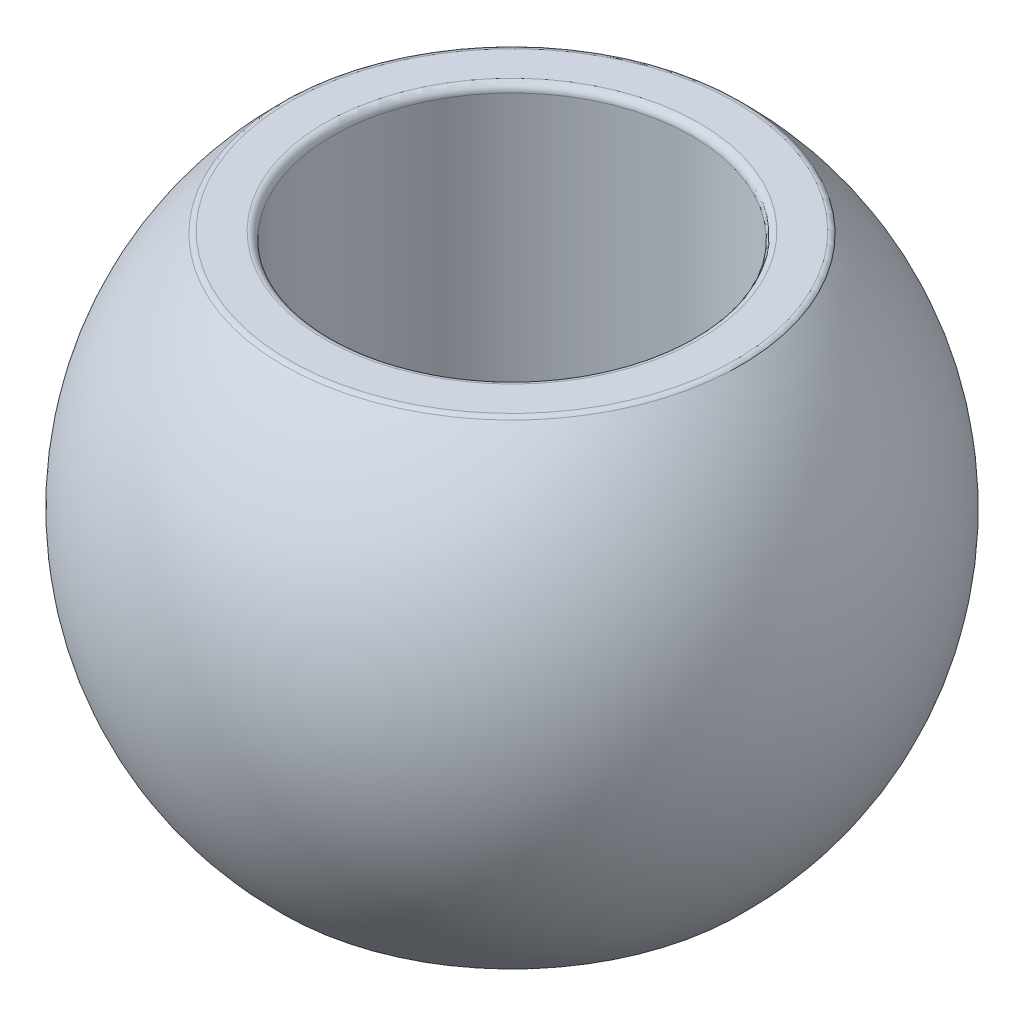
ISO-10303-21;
HEADER;
FILE_DESCRIPTION(('STEP AP214'),'2;1');
FILE_NAME('part.step','',(''),(''),'','','');
FILE_SCHEMA(('AUTOMOTIVE_DESIGN { 1 0 10303 214 1 1 1 1 }'));
ENDSEC;
DATA;
#1=APPLICATION_CONTEXT('core data for automotive mechanical design processes');
#2=APPLICATION_PROTOCOL_DEFINITION('international standard','automotive_design',2000,#1);
#3=PRODUCT_CONTEXT('',#1,'mechanical');
#4=PRODUCT('Part','Part','',(#3));
#5=PRODUCT_RELATED_PRODUCT_CATEGORY('part','',(#4));
#6=PRODUCT_DEFINITION_FORMATION('','',#4);
#7=PRODUCT_DEFINITION_CONTEXT('part definition',#1,'design');
#8=PRODUCT_DEFINITION('design','',#6,#7);
#9=PRODUCT_DEFINITION_SHAPE('','',#8);
#10=(LENGTH_UNIT() NAMED_UNIT(*) SI_UNIT(.MILLI.,.METRE.));
#11=(NAMED_UNIT(*) PLANE_ANGLE_UNIT() SI_UNIT($,.RADIAN.));
#12=(NAMED_UNIT(*) SI_UNIT($,.STERADIAN.) SOLID_ANGLE_UNIT());
#13=UNCERTAINTY_MEASURE_WITH_UNIT(LENGTH_MEASURE(1.E-05),#10,'distance_accuracy_value','');
#14=(GEOMETRIC_REPRESENTATION_CONTEXT(3) GLOBAL_UNCERTAINTY_ASSIGNED_CONTEXT((#13)) GLOBAL_UNIT_ASSIGNED_CONTEXT((#10,
#11,#12)) REPRESENTATION_CONTEXT('',''));
#15=CARTESIAN_POINT('',(0.,0.,0.));
#16=DIRECTION('',(0.,0.,1.));
#17=DIRECTION('',(1.,0.,0.));
#18=AXIS2_PLACEMENT_3D('',#15,#16,#17);
#19=CARTESIAN_POINT('',(0.,8.,0.));
#20=DIRECTION('',(0.,-1.,0.));
#21=DIRECTION('',(0.,0.,-1.));
#22=AXIS2_PLACEMENT_3D('',#19,#20,#21);
#23=PLANE('',#22);
#24=CARTESIAN_POINT('',(0.,8.,0.));
#25=DIRECTION('',(0.,-1.,0.));
#26=DIRECTION('',(0.,0.,-1.));
#27=AXIS2_PLACEMENT_3D('',#24,#25,#26);
#28=CIRCLE('',#27,7.44983221287567);
#29=CARTESIAN_POINT('',(0.,8.,-7.44983221287567));
#30=VERTEX_POINT('',#29);
#31=EDGE_CURVE('E41',#30,#30,#28,.F.);
#32=ORIENTED_EDGE('',*,*,#31,.T.);
#33=EDGE_LOOP('',(#32));
#34=FACE_BOUND('',#33,.T.);
#35=CARTESIAN_POINT('',(0.,8.,0.));
#36=DIRECTION('',(0.,-1.,0.));
#37=DIRECTION('',(0.,0.,-1.));
#38=AXIS2_PLACEMENT_3D('',#35,#36,#37);
#39=CIRCLE('',#38,6.25);
#40=CARTESIAN_POINT('',(0.,8.,-6.25));
#41=VERTEX_POINT('',#40);
#42=EDGE_CURVE('E45',#41,#41,#39,.T.);
#43=ORIENTED_EDGE('',*,*,#42,.T.);
#44=EDGE_LOOP('',(#43));
#45=FACE_BOUND('',#44,.T.);
#46=ADVANCED_FACE('F30',(#34,#45),#23,.F.);
#47=CARTESIAN_POINT('',(0.,0.,0.));
#48=DIRECTION('',(0.,1.,0.));
#49=DIRECTION('',(0.,0.,-1.));
#50=AXIS2_PLACEMENT_3D('',#47,#48,#49);
#51=SPHERICAL_SURFACE('',#50,11.);
#52=CARTESIAN_POINT('',(0.,-7.93023255813953,0.));
#53=DIRECTION('',(0.,1.,0.));
#54=DIRECTION('',(0.,0.,1.));
#55=AXIS2_PLACEMENT_3D('',#52,#53,#54);
#56=CIRCLE('',#55,7.62308412480301);
#57=CARTESIAN_POINT('',(0.,-7.93023255813953,-7.62308412480301));
#58=VERTEX_POINT('',#57);
#59=EDGE_CURVE('E56',#58,#58,#56,.T.);
#60=CARTESIAN_POINT('',(0.,7.93023255813953,0.));
#61=DIRECTION('',(0.,-1.,0.));
#62=DIRECTION('',(0.,0.,-1.));
#63=AXIS2_PLACEMENT_3D('',#60,#61,#62);
#64=CIRCLE('',#63,7.62308412480301);
#65=CARTESIAN_POINT('',(0.,7.93023255813953,-7.62308412480301));
#66=VERTEX_POINT('',#65);
#67=EDGE_CURVE('E59',#66,#66,#64,.T.);
#68=CARTESIAN_POINT('',(0.,-7.93023255813953,-7.62308412480301));
#69=CARTESIAN_POINT('',(0.,-7.80236716101044,-7.7561075440711));
#70=CARTESIAN_POINT('',(0.,-7.67114915701975,-7.88590769720583));
#71=CARTESIAN_POINT('',(0.,-7.40235284182454,-8.13874635493637));
#72=CARTESIAN_POINT('',(0.,-7.26477453062004,-8.26178485953218));
#73=CARTESIAN_POINT('',(0.,-6.9836025075066,-8.50078510391273));
#74=CARTESIAN_POINT('',(0.,-6.84000879559767,-8.61674684369746));
#75=CARTESIAN_POINT('',(0.,-6.54717042152934,-8.84130094546048));
#76=CARTESIAN_POINT('',(0.,-6.39792575936995,-8.94989330743876));
#77=CARTESIAN_POINT('',(0.,-6.09416308575483,-9.15943346871472));
#78=CARTESIAN_POINT('',(0.,-5.9396450742991,-9.26038126801238));
#79=CARTESIAN_POINT('',(0.,-5.62572696345227,-9.4543768022486));
#80=CARTESIAN_POINT('',(0.,-5.46632686406117,-9.54742453718715));
#81=CARTESIAN_POINT('',(0.,-5.14304811576543,-9.72538435351245));
#82=CARTESIAN_POINT('',(0.,-4.97916946686079,-9.8102964348992));
#83=CARTESIAN_POINT('',(0.,-4.64734851862144,-9.97176997574625));
#84=CARTESIAN_POINT('',(0.,-4.47940621928673,-10.0483314352065));
#85=CARTESIAN_POINT('',(0.,-4.13988315132462,-10.1929098989031));
#86=CARTESIAN_POINT('',(0.,-3.96830238269722,-10.2609269031393));
#87=CARTESIAN_POINT('',(0.,-3.62193677045902,-10.3882442569314));
#88=CARTESIAN_POINT('',(0.,-3.44715192684823,-10.4475446064873));
#89=CARTESIAN_POINT('',(0.,-3.09482067033618,-10.5572785191115));
#90=CARTESIAN_POINT('',(0.,-2.91727425743494,-10.6077120821799));
#91=CARTESIAN_POINT('',(0.,-2.55986935966188,-10.6995847383391));
#92=CARTESIAN_POINT('',(0.,-2.38001087479007,-10.7410238314299));
#93=CARTESIAN_POINT('',(0.,-2.01843718387728,-10.8148026355652));
#94=CARTESIAN_POINT('',(0.,-1.83672197783629,-10.8471423466096));
#95=CARTESIAN_POINT('',(0.,-1.47189489608757,-10.9026405116533));
#96=CARTESIAN_POINT('',(0.,-1.28878302037983,-10.9257989656526));
#97=CARTESIAN_POINT('',(0.,-0.921626186770326,-10.9628759859507));
#98=CARTESIAN_POINT('',(0.,-0.737581228868567,-10.9767945522496));
#99=CARTESIAN_POINT('',(0.,-0.369024180644539,-10.9953565592742));
#100=CARTESIAN_POINT('',(0.,-0.184512090322269,-11.));
#101=CARTESIAN_POINT('',(0.,0.184512090322271,-11.));
#102=CARTESIAN_POINT('',(0.,0.369024180644541,-10.9953565592742));
#103=CARTESIAN_POINT('',(0.,0.73758122886857,-10.9767945522496));
#104=CARTESIAN_POINT('',(0.,0.921626186770328,-10.9628759859507));
#105=CARTESIAN_POINT('',(0.,1.28878302037983,-10.9257989656526));
#106=CARTESIAN_POINT('',(0.,1.47189489608757,-10.9026405116533));
#107=CARTESIAN_POINT('',(0.,1.8367219778363,-10.8471423466096));
#108=CARTESIAN_POINT('',(0.,2.01843718387728,-10.8148026355652));
#109=CARTESIAN_POINT('',(0.,2.38001087479007,-10.7410238314299));
#110=CARTESIAN_POINT('',(0.,2.55986935966188,-10.6995847383391));
#111=CARTESIAN_POINT('',(0.,2.91727425743494,-10.6077120821799));
#112=CARTESIAN_POINT('',(0.,3.09482067033619,-10.5572785191115));
#113=CARTESIAN_POINT('',(0.,3.44715192684823,-10.4475446064873));
#114=CARTESIAN_POINT('',(0.,3.62193677045903,-10.3882442569314));
#115=CARTESIAN_POINT('',(0.,3.96830238269722,-10.2609269031393));
#116=CARTESIAN_POINT('',(0.,4.13988315132462,-10.1929098989031));
#117=CARTESIAN_POINT('',(0.,4.47940621928673,-10.0483314352065));
#118=CARTESIAN_POINT('',(0.,4.64734851862145,-9.97176997574625));
#119=CARTESIAN_POINT('',(0.,4.9791694668608,-9.8102964348992));
#120=CARTESIAN_POINT('',(0.,5.14304811576543,-9.72538435351245));
#121=CARTESIAN_POINT('',(0.,5.46632686406117,-9.54742453718714));
#122=CARTESIAN_POINT('',(0.,5.62572696345228,-9.4543768022486));
#123=CARTESIAN_POINT('',(0.,5.9396450742991,-9.26038126801238));
#124=CARTESIAN_POINT('',(0.,6.09416308575483,-9.15943346871471));
#125=CARTESIAN_POINT('',(0.,6.39792575936995,-8.94989330743876));
#126=CARTESIAN_POINT('',(0.,6.54717042152935,-8.84130094546048));
#127=CARTESIAN_POINT('',(0.,6.84000879559767,-8.61674684369746));
#128=CARTESIAN_POINT('',(0.,6.9836025075066,-8.50078510391273));
#129=CARTESIAN_POINT('',(0.,7.26477453062004,-8.26178485953218));
#130=CARTESIAN_POINT('',(0.,7.40235284182455,-8.13874635493636));
#131=CARTESIAN_POINT('',(0.,7.67114915701975,-7.88590769720582));
#132=CARTESIAN_POINT('',(0.,7.80236716101044,-7.7561075440711));
#133=CARTESIAN_POINT('',(0.,7.93023255813953,-7.62308412480301));
#134=B_SPLINE_CURVE_WITH_KNOTS('',3,(#68,#69,#70,#71,#72,#73,#74,#75,#76,#77,#78,#79,#80,#81,
#82,#83,#84,#85,#86,#87,#88,#89,#90,#91,#92,#93,#94,#95,#96,#97,#98,#99,#100,#101,#102,#103,
#104,#105,#106,#107,#108,#109,#110,#111,#112,#113,#114,#115,#116,#117,#118,#119,#120,#121,#122,
#123,#124,#125,#126,#127,#128,#129,#130,#131,#132,#133),.UNSPECIFIED.,.F.,.F.,(4,2,2,2,2,2,2,2,
2,2,2,2,2,2,2,2,2,2,2,2,2,2,2,2,2,2,2,2,2,2,2,2,4),(0.,0.553477888662464,1.10695577732493,
1.66043366598739,2.21391155464986,2.76738944331232,3.32086733197478,3.87434522063724,
4.42782310929971,4.98130099796217,5.53477888662464,6.0882567752871,6.64173466394956,
7.19521255261203,7.74869044127449,8.30216832993695,8.85564621859942,9.40912410726188,
9.96260199592435,10.5160798845868,11.0695577732493,11.6230356619117,12.1765135505742,
12.7299914392367,13.2834693278991,13.8369472165616,14.3904251052241,14.9439029938865,
15.497380882549,16.0508587712114,16.6043366598739,17.1578145485364,17.7112924371988),.UNSPECIFIED.);
#135=EDGE_CURVE('BSEAM63',#58,#66,#134,.T.);
#136=ORIENTED_EDGE('',*,*,#59,.T.);
#137=ORIENTED_EDGE('',*,*,#67,.T.);
#138=ORIENTED_EDGE('',*,*,#135,.T.);
#139=ORIENTED_EDGE('',*,*,#135,.F.);
#140=EDGE_LOOP('',(#136,#138,#137,#139));
#141=FACE_BOUND('',#140,.T.);
#142=ADVANCED_FACE('F63',(#141),#51,.T.);
#143=CARTESIAN_POINT('',(0.,-8.,0.));
#144=DIRECTION('',(0.,1.,0.));
#145=DIRECTION('',(0.,0.,1.));
#146=AXIS2_PLACEMENT_3D('',#143,#144,#145);
#147=PLANE('',#146);
#148=CARTESIAN_POINT('',(0.,-8.,0.));
#149=DIRECTION('',(0.,1.,0.));
#150=DIRECTION('',(0.,0.,1.));
#151=AXIS2_PLACEMENT_3D('',#148,#149,#150);
#152=CIRCLE('',#151,7.44983221287567);
#153=CARTESIAN_POINT('',(0.,-8.,7.44983221287567));
#154=VERTEX_POINT('',#153);
#155=EDGE_CURVE('E50',#154,#154,#152,.F.);
#156=ORIENTED_EDGE('',*,*,#155,.T.);
#157=EDGE_LOOP('',(#156));
#158=FACE_BOUND('',#157,.T.);
#159=CARTESIAN_POINT('',(0.,-8.,0.));
#160=DIRECTION('',(0.,1.,0.));
#161=DIRECTION('',(0.,0.,1.));
#162=AXIS2_PLACEMENT_3D('',#159,#160,#161);
#163=CIRCLE('',#162,6.25);
#164=CARTESIAN_POINT('',(0.,-8.,6.25));
#165=VERTEX_POINT('',#164);
#166=EDGE_CURVE('E53',#165,#165,#163,.T.);
#167=ORIENTED_EDGE('',*,*,#166,.T.);
#168=EDGE_LOOP('',(#167));
#169=FACE_BOUND('',#168,.T.);
#170=ADVANCED_FACE('F94',(#158,#169),#147,.F.);
#171=CARTESIAN_POINT('',(0.,-8.,0.));
#172=DIRECTION('',(0.,1.,0.));
#173=DIRECTION('',(0.,0.,1.));
#174=AXIS2_PLACEMENT_3D('',#171,#172,#173);
#175=CYLINDRICAL_SURFACE('',#174,6.);
#176=CARTESIAN_POINT('',(0.,-7.75,0.));
#177=DIRECTION('',(0.,1.,0.));
#178=DIRECTION('',(0.,0.,1.));
#179=AXIS2_PLACEMENT_3D('',#176,#177,#178);
#180=CIRCLE('',#179,6.);
#181=CARTESIAN_POINT('',(0.,-7.75,6.));
#182=VERTEX_POINT('',#181);
#183=EDGE_CURVE('E10',#182,#182,#180,.F.);
#184=ORIENTED_EDGE('',*,*,#183,.T.);
#185=EDGE_LOOP('',(#184));
#186=FACE_BOUND('',#185,.T.);
#187=CARTESIAN_POINT('',(0.,7.75,0.));
#188=DIRECTION('',(0.,-1.,0.));
#189=DIRECTION('',(0.,0.,-1.));
#190=AXIS2_PLACEMENT_3D('',#187,#188,#189);
#191=CIRCLE('',#190,6.);
#192=CARTESIAN_POINT('',(0.,7.75,-6.));
#193=VERTEX_POINT('',#192);
#194=EDGE_CURVE('E37',#193,#193,#191,.F.);
#195=ORIENTED_EDGE('',*,*,#194,.T.);
#196=EDGE_LOOP('',(#195));
#197=FACE_BOUND('',#196,.T.);
#198=ADVANCED_FACE('F89',(#186,#197),#175,.F.);
#199=CARTESIAN_POINT('',(0.,-7.75,0.));
#200=DIRECTION('',(0.,1.,0.));
#201=DIRECTION('',(0.,0.,1.));
#202=AXIS2_PLACEMENT_3D('',#199,#200,#201);
#203=TOROIDAL_SURFACE('',#202,7.44983221287567,0.25);
#204=ORIENTED_EDGE('',*,*,#155,.F.);
#205=EDGE_LOOP('',(#204));
#206=FACE_BOUND('',#205,.T.);
#207=ORIENTED_EDGE('',*,*,#59,.F.);
#208=EDGE_LOOP('',(#207));
#209=FACE_BOUND('',#208,.T.);
#210=ADVANCED_FACE('F69',(#206,#209),#203,.T.);
#211=CARTESIAN_POINT('',(0.,7.75,0.));
#212=DIRECTION('',(0.,-1.,0.));
#213=DIRECTION('',(0.,0.,-1.));
#214=AXIS2_PLACEMENT_3D('',#211,#212,#213);
#215=TOROIDAL_SURFACE('',#214,7.44983221287567,0.25);
#216=ORIENTED_EDGE('',*,*,#67,.F.);
#217=EDGE_LOOP('',(#216));
#218=FACE_BOUND('',#217,.T.);
#219=ORIENTED_EDGE('',*,*,#31,.F.);
#220=EDGE_LOOP('',(#219));
#221=FACE_BOUND('',#220,.T.);
#222=ADVANCED_FACE('F65',(#218,#221),#215,.T.);
#223=CARTESIAN_POINT('',(0.,-7.75,0.));
#224=DIRECTION('',(0.,1.,0.));
#225=DIRECTION('',(0.,0.,1.));
#226=AXIS2_PLACEMENT_3D('',#223,#224,#225);
#227=TOROIDAL_SURFACE('',#226,6.25,0.25);
#228=ORIENTED_EDGE('',*,*,#183,.F.);
#229=EDGE_LOOP('',(#228));
#230=FACE_BOUND('',#229,.T.);
#231=ORIENTED_EDGE('',*,*,#166,.F.);
#232=EDGE_LOOP('',(#231));
#233=FACE_BOUND('',#232,.T.);
#234=ADVANCED_FACE('F68',(#230,#233),#227,.T.);
#235=CARTESIAN_POINT('',(0.,7.75,0.));
#236=DIRECTION('',(0.,-1.,0.));
#237=DIRECTION('',(0.,0.,-1.));
#238=AXIS2_PLACEMENT_3D('',#235,#236,#237);
#239=TOROIDAL_SURFACE('',#238,6.25,0.25);
#240=ORIENTED_EDGE('',*,*,#42,.F.);
#241=EDGE_LOOP('',(#240));
#242=FACE_BOUND('',#241,.T.);
#243=ORIENTED_EDGE('',*,*,#194,.F.);
#244=EDGE_LOOP('',(#243));
#245=FACE_BOUND('',#244,.T.);
#246=ADVANCED_FACE('F32',(#242,#245),#239,.T.);
#247=CLOSED_SHELL('',(#46,#142,#170,#198,#210,#222,#234,#246));
#248=MANIFOLD_SOLID_BREP('B2',#247);
#249=ADVANCED_BREP_SHAPE_REPRESENTATION('',(#18,#248),#14);
#250=SHAPE_DEFINITION_REPRESENTATION(#9,#249);
ENDSEC;
END-ISO-10303-21;
